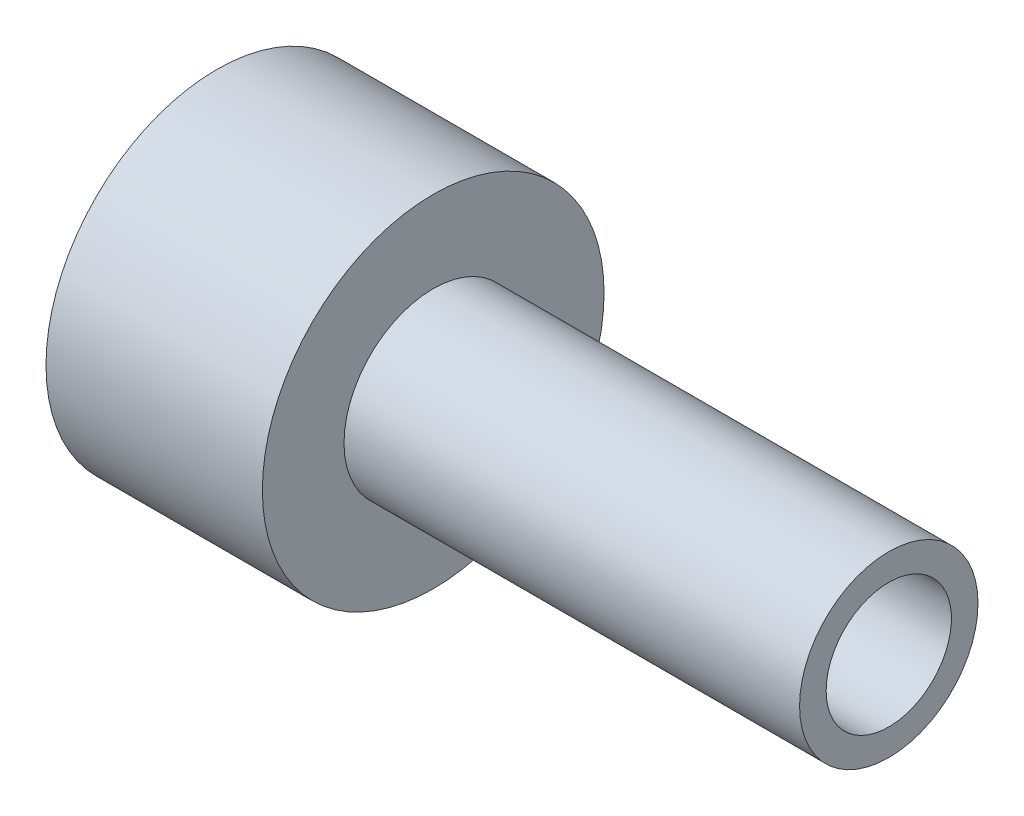
ISO-10303-21;
HEADER;
FILE_DESCRIPTION(('STEP AP214'),'2;1');
FILE_NAME('part.step','',(''),(''),'','','');
FILE_SCHEMA(('AUTOMOTIVE_DESIGN { 1 0 10303 214 1 1 1 1 }'));
ENDSEC;
DATA;
#1=APPLICATION_CONTEXT('core data for automotive mechanical design processes');
#2=APPLICATION_PROTOCOL_DEFINITION('international standard','automotive_design',2000,#1);
#3=PRODUCT_CONTEXT('',#1,'mechanical');
#4=PRODUCT('Part','Part','',(#3));
#5=PRODUCT_RELATED_PRODUCT_CATEGORY('part','',(#4));
#6=PRODUCT_DEFINITION_FORMATION('','',#4);
#7=PRODUCT_DEFINITION_CONTEXT('part definition',#1,'design');
#8=PRODUCT_DEFINITION('design','',#6,#7);
#9=PRODUCT_DEFINITION_SHAPE('','',#8);
#10=(LENGTH_UNIT() NAMED_UNIT(*) SI_UNIT(.MILLI.,.METRE.));
#11=(NAMED_UNIT(*) PLANE_ANGLE_UNIT() SI_UNIT($,.RADIAN.));
#12=(NAMED_UNIT(*) SI_UNIT($,.STERADIAN.) SOLID_ANGLE_UNIT());
#13=UNCERTAINTY_MEASURE_WITH_UNIT(LENGTH_MEASURE(1.E-05),#10,'distance_accuracy_value','');
#14=(GEOMETRIC_REPRESENTATION_CONTEXT(3) GLOBAL_UNCERTAINTY_ASSIGNED_CONTEXT((#13)) GLOBAL_UNIT_ASSIGNED_CONTEXT((#10,
#11,#12)) REPRESENTATION_CONTEXT('',''));
#15=CARTESIAN_POINT('',(0.,0.,0.));
#16=DIRECTION('',(0.,0.,1.));
#17=DIRECTION('',(1.,0.,0.));
#18=AXIS2_PLACEMENT_3D('',#15,#16,#17);
#19=CARTESIAN_POINT('',(8.,4.5,0.));
#20=DIRECTION('',(1.,0.,0.));
#21=DIRECTION('',(0.,0.,-1.));
#22=AXIS2_PLACEMENT_3D('',#19,#20,#21);
#23=PLANE('',#22);
#24=CARTESIAN_POINT('',(7.99999999999999,0.,0.));
#25=DIRECTION('',(-1.,0.,0.));
#26=DIRECTION('',(0.,0.,1.));
#27=AXIS2_PLACEMENT_3D('',#24,#25,#26);
#28=CIRCLE('',#27,1.65);
#29=CARTESIAN_POINT('',(7.99999999999999,0.,1.65));
#30=VERTEX_POINT('',#29);
#31=EDGE_CURVE('E10',#30,#30,#28,.T.);
#32=ORIENTED_EDGE('',*,*,#31,.F.);
#33=EDGE_LOOP('',(#32));
#34=FACE_BOUND('',#33,.T.);
#35=CARTESIAN_POINT('',(7.99999999999999,0.,0.));
#36=DIRECTION('',(-1.,0.,0.));
#37=DIRECTION('',(0.,0.,1.));
#38=AXIS2_PLACEMENT_3D('',#35,#36,#37);
#39=CIRCLE('',#38,4.5);
#40=CARTESIAN_POINT('',(7.99999999999999,0.,4.5));
#41=VERTEX_POINT('',#40);
#42=EDGE_CURVE('E49',#41,#41,#39,.T.);
#43=ORIENTED_EDGE('',*,*,#42,.T.);
#44=EDGE_LOOP('',(#43));
#45=FACE_BOUND('',#44,.T.);
#46=ADVANCED_FACE('F27',(#34,#45),#23,.F.);
#47=CARTESIAN_POINT('',(-110.,0.,0.));
#48=DIRECTION('',(-1.,0.,0.));
#49=DIRECTION('',(0.,0.,1.));
#50=AXIS2_PLACEMENT_3D('',#47,#48,#49);
#51=CYLINDRICAL_SURFACE('',#50,1.65);
#52=CARTESIAN_POINT('',(25.7,0.,0.));
#53=DIRECTION('',(-1.,0.,0.));
#54=DIRECTION('',(0.,0.,1.));
#55=AXIS2_PLACEMENT_3D('',#52,#53,#54);
#56=CIRCLE('',#55,1.65);
#57=CARTESIAN_POINT('',(25.7,0.,1.65));
#58=VERTEX_POINT('',#57);
#59=EDGE_CURVE('E33',#58,#58,#56,.T.);
#60=ORIENTED_EDGE('',*,*,#59,.F.);
#61=EDGE_LOOP('',(#60));
#62=FACE_BOUND('',#61,.T.);
#63=ORIENTED_EDGE('',*,*,#31,.T.);
#64=EDGE_LOOP('',(#63));
#65=FACE_BOUND('',#64,.T.);
#66=ADVANCED_FACE('F74',(#62,#65),#51,.F.);
#67=CARTESIAN_POINT('',(25.7,1.65,0.));
#68=DIRECTION('',(-1.,0.,0.));
#69=DIRECTION('',(0.,0.,1.));
#70=AXIS2_PLACEMENT_3D('',#67,#68,#69);
#71=PLANE('',#70);
#72=CARTESIAN_POINT('',(25.7,0.,0.));
#73=DIRECTION('',(-1.,0.,0.));
#74=DIRECTION('',(0.,0.,1.));
#75=AXIS2_PLACEMENT_3D('',#72,#73,#74);
#76=CIRCLE('',#75,2.35);
#77=CARTESIAN_POINT('',(25.7,0.,2.35));
#78=VERTEX_POINT('',#77);
#79=EDGE_CURVE('E37',#78,#78,#76,.T.);
#80=ORIENTED_EDGE('',*,*,#79,.F.);
#81=EDGE_LOOP('',(#80));
#82=FACE_BOUND('',#81,.T.);
#83=ORIENTED_EDGE('',*,*,#59,.T.);
#84=EDGE_LOOP('',(#83));
#85=FACE_BOUND('',#84,.T.);
#86=ADVANCED_FACE('F69',(#82,#85),#71,.F.);
#87=CARTESIAN_POINT('',(-110.,0.,0.));
#88=DIRECTION('',(-1.,0.,0.));
#89=DIRECTION('',(0.,0.,1.));
#90=AXIS2_PLACEMENT_3D('',#87,#88,#89);
#91=CYLINDRICAL_SURFACE('',#90,2.35);
#92=CARTESIAN_POINT('',(13.7,0.,0.));
#93=DIRECTION('',(-1.,0.,0.));
#94=DIRECTION('',(0.,0.,1.));
#95=AXIS2_PLACEMENT_3D('',#92,#93,#94);
#96=CIRCLE('',#95,2.35);
#97=CARTESIAN_POINT('',(13.7,0.,2.35));
#98=VERTEX_POINT('',#97);
#99=EDGE_CURVE('E41',#98,#98,#96,.T.);
#100=ORIENTED_EDGE('',*,*,#99,.F.);
#101=EDGE_LOOP('',(#100));
#102=FACE_BOUND('',#101,.T.);
#103=ORIENTED_EDGE('',*,*,#79,.T.);
#104=EDGE_LOOP('',(#103));
#105=FACE_BOUND('',#104,.T.);
#106=ADVANCED_FACE('F63',(#102,#105),#91,.T.);
#107=CARTESIAN_POINT('',(13.7,2.35,0.));
#108=DIRECTION('',(-1.,0.,0.));
#109=DIRECTION('',(0.,0.,1.));
#110=AXIS2_PLACEMENT_3D('',#107,#108,#109);
#111=PLANE('',#110);
#112=CARTESIAN_POINT('',(13.7,0.,0.));
#113=DIRECTION('',(-1.,0.,0.));
#114=DIRECTION('',(0.,0.,1.));
#115=AXIS2_PLACEMENT_3D('',#112,#113,#114);
#116=CIRCLE('',#115,4.5);
#117=CARTESIAN_POINT('',(13.7,0.,4.5));
#118=VERTEX_POINT('',#117);
#119=EDGE_CURVE('E46',#118,#118,#116,.T.);
#120=ORIENTED_EDGE('',*,*,#119,.F.);
#121=EDGE_LOOP('',(#120));
#122=FACE_BOUND('',#121,.T.);
#123=ORIENTED_EDGE('',*,*,#99,.T.);
#124=EDGE_LOOP('',(#123));
#125=FACE_BOUND('',#124,.T.);
#126=ADVANCED_FACE('F57',(#122,#125),#111,.F.);
#127=CARTESIAN_POINT('',(-110.,0.,0.));
#128=DIRECTION('',(-1.,0.,0.));
#129=DIRECTION('',(0.,0.,1.));
#130=AXIS2_PLACEMENT_3D('',#127,#128,#129);
#131=CYLINDRICAL_SURFACE('',#130,4.5);
#132=ORIENTED_EDGE('',*,*,#42,.F.);
#133=EDGE_LOOP('',(#132));
#134=FACE_BOUND('',#133,.T.);
#135=ORIENTED_EDGE('',*,*,#119,.T.);
#136=EDGE_LOOP('',(#135));
#137=FACE_BOUND('',#136,.T.);
#138=ADVANCED_FACE('F54',(#134,#137),#131,.T.);
#139=CLOSED_SHELL('',(#46,#66,#86,#106,#126,#138));
#140=MANIFOLD_SOLID_BREP('B2',#139);
#141=ADVANCED_BREP_SHAPE_REPRESENTATION('',(#18,#140),#14);
#142=SHAPE_DEFINITION_REPRESENTATION(#9,#141);
ENDSEC;
END-ISO-10303-21;
